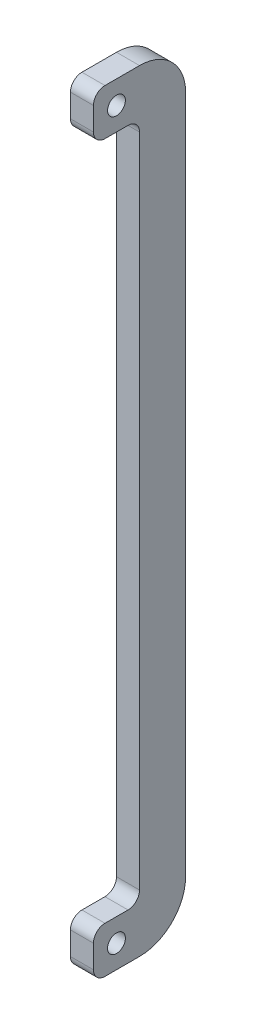
ISO-10303-21;
HEADER;
FILE_DESCRIPTION(('STEP AP214'),'2;1');
FILE_NAME('part.step','',(''),(''),'','','');
FILE_SCHEMA(('AUTOMOTIVE_DESIGN { 1 0 10303 214 1 1 1 1 }'));
ENDSEC;
DATA;
#1=APPLICATION_CONTEXT('core data for automotive mechanical design processes');
#2=APPLICATION_PROTOCOL_DEFINITION('international standard','automotive_design',2000,#1);
#3=PRODUCT_CONTEXT('',#1,'mechanical');
#4=PRODUCT('Part','Part','',(#3));
#5=PRODUCT_RELATED_PRODUCT_CATEGORY('part','',(#4));
#6=PRODUCT_DEFINITION_FORMATION('','',#4);
#7=PRODUCT_DEFINITION_CONTEXT('part definition',#1,'design');
#8=PRODUCT_DEFINITION('design','',#6,#7);
#9=PRODUCT_DEFINITION_SHAPE('','',#8);
#10=(LENGTH_UNIT() NAMED_UNIT(*) SI_UNIT(.MILLI.,.METRE.));
#11=(NAMED_UNIT(*) PLANE_ANGLE_UNIT() SI_UNIT($,.RADIAN.));
#12=(NAMED_UNIT(*) SI_UNIT($,.STERADIAN.) SOLID_ANGLE_UNIT());
#13=UNCERTAINTY_MEASURE_WITH_UNIT(LENGTH_MEASURE(1.E-05),#10,'distance_accuracy_value','');
#14=(GEOMETRIC_REPRESENTATION_CONTEXT(3) GLOBAL_UNCERTAINTY_ASSIGNED_CONTEXT((#13)) GLOBAL_UNIT_ASSIGNED_CONTEXT((#10,
#11,#12)) REPRESENTATION_CONTEXT('',''));
#15=CARTESIAN_POINT('',(0.,0.,0.));
#16=DIRECTION('',(0.,0.,1.));
#17=DIRECTION('',(1.,0.,0.));
#18=AXIS2_PLACEMENT_3D('',#15,#16,#17);
#19=CARTESIAN_POINT('',(4.,-122.02,4.));
#20=DIRECTION('',(-1.,0.,0.));
#21=DIRECTION('',(0.,0.,1.));
#22=AXIS2_PLACEMENT_3D('',#19,#20,#21);
#23=CYLINDRICAL_SURFACE('',#22,1.55);
#24=CARTESIAN_POINT('',(4.,-122.02,4.));
#25=DIRECTION('',(1.,0.,0.));
#26=DIRECTION('',(0.,0.,-1.));
#27=AXIS2_PLACEMENT_3D('',#24,#25,#26);
#28=CIRCLE('',#27,1.55);
#29=CARTESIAN_POINT('',(4.,-122.02,2.45));
#30=VERTEX_POINT('',#29);
#31=EDGE_CURVE('E232',#30,#30,#28,.F.);
#32=ORIENTED_EDGE('',*,*,#31,.F.);
#33=EDGE_LOOP('',(#32));
#34=FACE_BOUND('',#33,.T.);
#35=CARTESIAN_POINT('',(0.,-122.02,4.));
#36=DIRECTION('',(1.,0.,0.));
#37=DIRECTION('',(0.,0.,-1.));
#38=AXIS2_PLACEMENT_3D('',#35,#36,#37);
#39=CIRCLE('',#38,1.55);
#40=CARTESIAN_POINT('',(0.,-122.02,2.45));
#41=VERTEX_POINT('',#40);
#42=EDGE_CURVE('E204',#41,#41,#39,.F.);
#43=ORIENTED_EDGE('',*,*,#42,.T.);
#44=EDGE_LOOP('',(#43));
#45=FACE_BOUND('',#44,.T.);
#46=ADVANCED_FACE('F69',(#34,#45),#23,.F.);
#47=CARTESIAN_POINT('',(4.,4.,4.));
#48=DIRECTION('',(-1.,0.,0.));
#49=DIRECTION('',(0.,0.,1.));
#50=AXIS2_PLACEMENT_3D('',#47,#48,#49);
#51=CYLINDRICAL_SURFACE('',#50,1.55);
#52=CARTESIAN_POINT('',(4.,4.,4.));
#53=DIRECTION('',(1.,0.,0.));
#54=DIRECTION('',(0.,0.,-1.));
#55=AXIS2_PLACEMENT_3D('',#52,#53,#54);
#56=CIRCLE('',#55,1.55);
#57=CARTESIAN_POINT('',(4.,4.,2.45));
#58=VERTEX_POINT('',#57);
#59=EDGE_CURVE('E229',#58,#58,#56,.T.);
#60=ORIENTED_EDGE('',*,*,#59,.T.);
#61=EDGE_LOOP('',(#60));
#62=FACE_BOUND('',#61,.T.);
#63=CARTESIAN_POINT('',(0.,4.,4.));
#64=DIRECTION('',(1.,0.,0.));
#65=DIRECTION('',(0.,0.,-1.));
#66=AXIS2_PLACEMENT_3D('',#63,#64,#65);
#67=CIRCLE('',#66,1.55);
#68=CARTESIAN_POINT('',(0.,4.,2.45));
#69=VERTEX_POINT('',#68);
#70=EDGE_CURVE('E261',#69,#69,#67,.T.);
#71=ORIENTED_EDGE('',*,*,#70,.F.);
#72=EDGE_LOOP('',(#71));
#73=FACE_BOUND('',#72,.T.);
#74=ADVANCED_FACE('F382',(#62,#73),#51,.F.);
#75=CARTESIAN_POINT('',(4.,0.,-8.));
#76=DIRECTION('',(0.,0.,-1.));
#77=DIRECTION('',(0.,1.,0.));
#78=AXIS2_PLACEMENT_3D('',#75,#76,#77);
#79=PLANE('',#78);
#80=DIRECTION('',(0.,-1.,0.));
#81=VECTOR('',#80,1.);
#82=CARTESIAN_POINT('',(0.,0.,-8.));
#83=LINE('',#82,#81);
#84=CARTESIAN_POINT('',(0.,0.,-8.));
#85=VERTEX_POINT('',#84);
#86=CARTESIAN_POINT('',(0.,-118.02,-8.00000000000001));
#87=VERTEX_POINT('',#86);
#88=EDGE_CURVE('E237',#85,#87,#83,.T.);
#89=ORIENTED_EDGE('',*,*,#88,.F.);
#90=DIRECTION('',(-1.,0.,0.));
#91=VECTOR('',#90,1.);
#92=CARTESIAN_POINT('',(4.,0.,-8.));
#93=LINE('',#92,#91);
#94=CARTESIAN_POINT('',(4.,0.,-8.));
#95=VERTEX_POINT('',#94);
#96=EDGE_CURVE('E195',#95,#85,#93,.T.);
#97=ORIENTED_EDGE('',*,*,#96,.F.);
#98=DIRECTION('',(0.,-1.,0.));
#99=VECTOR('',#98,1.);
#100=CARTESIAN_POINT('',(4.,0.,-8.));
#101=LINE('',#100,#99);
#102=CARTESIAN_POINT('',(4.,-118.02,-8.00000000000001));
#103=VERTEX_POINT('',#102);
#104=EDGE_CURVE('E201',#95,#103,#101,.T.);
#105=ORIENTED_EDGE('',*,*,#104,.T.);
#106=DIRECTION('',(-1.,0.,0.));
#107=VECTOR('',#106,1.);
#108=CARTESIAN_POINT('',(4.,-118.02,-8.00000000000001));
#109=LINE('',#108,#107);
#110=EDGE_CURVE('E183',#103,#87,#109,.T.);
#111=ORIENTED_EDGE('',*,*,#110,.T.);
#112=EDGE_LOOP('',(#89,#97,#105,#111));
#113=FACE_BOUND('',#112,.T.);
#114=ADVANCED_FACE('F206',(#113),#79,.T.);
#115=CARTESIAN_POINT('',(4.,0.,0.));
#116=DIRECTION('',(-1.,0.,0.));
#117=DIRECTION('',(0.,0.,1.));
#118=AXIS2_PLACEMENT_3D('',#115,#116,#117);
#119=CYLINDRICAL_SURFACE('',#118,8.);
#120=CARTESIAN_POINT('',(0.,0.,0.));
#121=DIRECTION('',(1.,0.,0.));
#122=DIRECTION('',(0.,0.,-1.));
#123=AXIS2_PLACEMENT_3D('',#120,#121,#122);
#124=CIRCLE('',#123,8.);
#125=CARTESIAN_POINT('',(0.,8.,0.));
#126=VERTEX_POINT('',#125);
#127=EDGE_CURVE('E239',#85,#126,#124,.T.);
#128=ORIENTED_EDGE('',*,*,#127,.T.);
#129=DIRECTION('',(-1.,0.,0.));
#130=VECTOR('',#129,1.);
#131=CARTESIAN_POINT('',(4.,8.,0.));
#132=LINE('',#131,#130);
#133=CARTESIAN_POINT('',(4.,8.,0.));
#134=VERTEX_POINT('',#133);
#135=EDGE_CURVE('E267',#134,#126,#132,.T.);
#136=ORIENTED_EDGE('',*,*,#135,.F.);
#137=CARTESIAN_POINT('',(4.,0.,0.));
#138=DIRECTION('',(1.,0.,0.));
#139=DIRECTION('',(0.,0.,-1.));
#140=AXIS2_PLACEMENT_3D('',#137,#138,#139);
#141=CIRCLE('',#140,8.);
#142=EDGE_CURVE('E208',#95,#134,#141,.T.);
#143=ORIENTED_EDGE('',*,*,#142,.F.);
#144=ORIENTED_EDGE('',*,*,#96,.T.);
#145=EDGE_LOOP('',(#128,#136,#143,#144));
#146=FACE_BOUND('',#145,.T.);
#147=ADVANCED_FACE('F359',(#146),#119,.T.);
#148=CARTESIAN_POINT('',(4.,8.,0.));
#149=DIRECTION('',(0.,-1.,0.));
#150=DIRECTION('',(0.,0.,-1.));
#151=AXIS2_PLACEMENT_3D('',#148,#149,#150);
#152=PLANE('',#151);
#153=DIRECTION('',(0.,0.,1.));
#154=VECTOR('',#153,1.);
#155=CARTESIAN_POINT('',(0.,8.,0.));
#156=LINE('',#155,#154);
#157=CARTESIAN_POINT('',(0.,8.,6.));
#158=VERTEX_POINT('',#157);
#159=EDGE_CURVE('E241',#126,#158,#156,.T.);
#160=ORIENTED_EDGE('',*,*,#159,.T.);
#161=DIRECTION('',(-1.,0.,0.));
#162=VECTOR('',#161,1.);
#163=CARTESIAN_POINT('',(4.,8.,6.));
#164=LINE('',#163,#162);
#165=CARTESIAN_POINT('',(4.,8.,6.));
#166=VERTEX_POINT('',#165);
#167=EDGE_CURVE('E313',#158,#166,#164,.F.);
#168=ORIENTED_EDGE('',*,*,#167,.T.);
#169=DIRECTION('',(0.,0.,1.));
#170=VECTOR('',#169,1.);
#171=CARTESIAN_POINT('',(4.,8.,0.));
#172=LINE('',#171,#170);
#173=EDGE_CURVE('E210',#134,#166,#172,.T.);
#174=ORIENTED_EDGE('',*,*,#173,.F.);
#175=ORIENTED_EDGE('',*,*,#135,.T.);
#176=EDGE_LOOP('',(#160,#168,#174,#175));
#177=FACE_BOUND('',#176,.T.);
#178=ADVANCED_FACE('F362',(#177),#152,.F.);
#179=CARTESIAN_POINT('',(4.,0.,8.));
#180=DIRECTION('',(0.,0.,-1.));
#181=DIRECTION('',(0.,1.,0.));
#182=AXIS2_PLACEMENT_3D('',#179,#180,#181);
#183=PLANE('',#182);
#184=DIRECTION('',(0.,-1.,0.));
#185=VECTOR('',#184,1.);
#186=CARTESIAN_POINT('',(0.,0.,8.));
#187=LINE('',#186,#185);
#188=CARTESIAN_POINT('',(0.,6.,8.));
#189=VERTEX_POINT('',#188);
#190=CARTESIAN_POINT('',(0.,2.,8.));
#191=VERTEX_POINT('',#190);
#192=EDGE_CURVE('E244',#189,#191,#187,.T.);
#193=ORIENTED_EDGE('',*,*,#192,.T.);
#194=DIRECTION('',(-1.,0.,0.));
#195=VECTOR('',#194,1.);
#196=CARTESIAN_POINT('',(4.,2.,8.));
#197=LINE('',#196,#195);
#198=CARTESIAN_POINT('',(4.,2.,8.));
#199=VERTEX_POINT('',#198);
#200=EDGE_CURVE('E311',#191,#199,#197,.F.);
#201=ORIENTED_EDGE('',*,*,#200,.T.);
#202=DIRECTION('',(0.,-1.,0.));
#203=VECTOR('',#202,1.);
#204=CARTESIAN_POINT('',(4.,0.,8.));
#205=LINE('',#204,#203);
#206=CARTESIAN_POINT('',(4.,6.,8.));
#207=VERTEX_POINT('',#206);
#208=EDGE_CURVE('E215',#207,#199,#205,.T.);
#209=ORIENTED_EDGE('',*,*,#208,.F.);
#210=DIRECTION('',(-1.,0.,0.));
#211=VECTOR('',#210,1.);
#212=CARTESIAN_POINT('',(4.,6.,8.));
#213=LINE('',#212,#211);
#214=EDGE_CURVE('E308',#207,#189,#213,.T.);
#215=ORIENTED_EDGE('',*,*,#214,.T.);
#216=EDGE_LOOP('',(#193,#201,#209,#215));
#217=FACE_BOUND('',#216,.T.);
#218=ADVANCED_FACE('F370',(#217),#183,.F.);
#219=CARTESIAN_POINT('',(4.,0.,0.));
#220=DIRECTION('',(0.,-1.,0.));
#221=DIRECTION('',(0.,0.,-1.));
#222=AXIS2_PLACEMENT_3D('',#219,#220,#221);
#223=PLANE('',#222);
#224=DIRECTION('',(0.,0.,1.));
#225=VECTOR('',#224,1.);
#226=CARTESIAN_POINT('',(0.,0.,0.));
#227=LINE('',#226,#225);
#228=CARTESIAN_POINT('',(0.,0.,2.));
#229=VERTEX_POINT('',#228);
#230=CARTESIAN_POINT('',(0.,0.,6.));
#231=VERTEX_POINT('',#230);
#232=EDGE_CURVE('E247',#229,#231,#227,.T.);
#233=ORIENTED_EDGE('',*,*,#232,.F.);
#234=DIRECTION('',(-1.,0.,0.));
#235=VECTOR('',#234,1.);
#236=CARTESIAN_POINT('',(4.,0.,2.));
#237=LINE('',#236,#235);
#238=CARTESIAN_POINT('',(4.,0.,2.));
#239=VERTEX_POINT('',#238);
#240=EDGE_CURVE('E306',#229,#239,#237,.F.);
#241=ORIENTED_EDGE('',*,*,#240,.T.);
#242=DIRECTION('',(0.,0.,1.));
#243=VECTOR('',#242,1.);
#244=CARTESIAN_POINT('',(4.,0.,0.));
#245=LINE('',#244,#243);
#246=CARTESIAN_POINT('',(4.,0.,6.));
#247=VERTEX_POINT('',#246);
#248=EDGE_CURVE('E218',#239,#247,#245,.T.);
#249=ORIENTED_EDGE('',*,*,#248,.T.);
#250=DIRECTION('',(-1.,0.,0.));
#251=VECTOR('',#250,1.);
#252=CARTESIAN_POINT('',(0.,0.,6.));
#253=LINE('',#252,#251);
#254=EDGE_CURVE('E303',#247,#231,#253,.T.);
#255=ORIENTED_EDGE('',*,*,#254,.T.);
#256=EDGE_LOOP('',(#233,#241,#249,#255));
#257=FACE_BOUND('',#256,.T.);
#258=ADVANCED_FACE('F326',(#257),#223,.T.);
#259=CARTESIAN_POINT('',(4.,0.,0.));
#260=DIRECTION('',(0.,0.,-1.));
#261=DIRECTION('',(0.,1.,0.));
#262=AXIS2_PLACEMENT_3D('',#259,#260,#261);
#263=PLANE('',#262);
#264=DIRECTION('',(0.,-1.,0.));
#265=VECTOR('',#264,1.);
#266=CARTESIAN_POINT('',(0.,0.,0.));
#267=LINE('',#266,#265);
#268=CARTESIAN_POINT('',(0.,-2.,0.));
#269=VERTEX_POINT('',#268);
#270=CARTESIAN_POINT('',(0.,-116.02,0.));
#271=VERTEX_POINT('',#270);
#272=EDGE_CURVE('E250',#269,#271,#267,.T.);
#273=ORIENTED_EDGE('',*,*,#272,.T.);
#274=DIRECTION('',(-1.,0.,0.));
#275=VECTOR('',#274,1.);
#276=CARTESIAN_POINT('',(4.,-116.02,0.));
#277=LINE('',#276,#275);
#278=CARTESIAN_POINT('',(4.,-116.02,0.));
#279=VERTEX_POINT('',#278);
#280=EDGE_CURVE('E301',#271,#279,#277,.F.);
#281=ORIENTED_EDGE('',*,*,#280,.T.);
#282=DIRECTION('',(0.,-1.,0.));
#283=VECTOR('',#282,1.);
#284=CARTESIAN_POINT('',(4.,0.,0.));
#285=LINE('',#284,#283);
#286=CARTESIAN_POINT('',(4.,-2.,0.));
#287=VERTEX_POINT('',#286);
#288=EDGE_CURVE('E221',#287,#279,#285,.T.);
#289=ORIENTED_EDGE('',*,*,#288,.F.);
#290=DIRECTION('',(-1.,0.,0.));
#291=VECTOR('',#290,1.);
#292=CARTESIAN_POINT('',(4.,-2.,0.));
#293=LINE('',#292,#291);
#294=EDGE_CURVE('E298',#287,#269,#293,.T.);
#295=ORIENTED_EDGE('',*,*,#294,.T.);
#296=EDGE_LOOP('',(#273,#281,#289,#295));
#297=FACE_BOUND('',#296,.T.);
#298=ADVANCED_FACE('F333',(#297),#263,.F.);
#299=CARTESIAN_POINT('',(4.,-118.02,0.));
#300=DIRECTION('',(0.,-1.,0.));
#301=DIRECTION('',(0.,0.,-1.));
#302=AXIS2_PLACEMENT_3D('',#299,#300,#301);
#303=PLANE('',#302);
#304=DIRECTION('',(0.,0.,1.));
#305=VECTOR('',#304,1.);
#306=CARTESIAN_POINT('',(0.,-118.02,0.));
#307=LINE('',#306,#305);
#308=CARTESIAN_POINT('',(0.,-118.02,1.99999999999999));
#309=VERTEX_POINT('',#308);
#310=CARTESIAN_POINT('',(0.,-118.02,6.));
#311=VERTEX_POINT('',#310);
#312=EDGE_CURVE('E253',#309,#311,#307,.T.);
#313=ORIENTED_EDGE('',*,*,#312,.T.);
#314=DIRECTION('',(-1.,0.,0.));
#315=VECTOR('',#314,1.);
#316=CARTESIAN_POINT('',(4.,-118.02,6.));
#317=LINE('',#316,#315);
#318=CARTESIAN_POINT('',(4.,-118.02,6.));
#319=VERTEX_POINT('',#318);
#320=EDGE_CURVE('E84',#311,#319,#317,.F.);
#321=ORIENTED_EDGE('',*,*,#320,.T.);
#322=DIRECTION('',(0.,0.,1.));
#323=VECTOR('',#322,1.);
#324=CARTESIAN_POINT('',(4.,-118.02,0.));
#325=LINE('',#324,#323);
#326=CARTESIAN_POINT('',(4.,-118.02,1.99999999999999));
#327=VERTEX_POINT('',#326);
#328=EDGE_CURVE('E223',#327,#319,#325,.T.);
#329=ORIENTED_EDGE('',*,*,#328,.F.);
#330=DIRECTION('',(-1.,0.,0.));
#331=VECTOR('',#330,1.);
#332=CARTESIAN_POINT('',(0.,-118.02,1.99999999999999));
#333=LINE('',#332,#331);
#334=EDGE_CURVE('E294',#327,#309,#333,.T.);
#335=ORIENTED_EDGE('',*,*,#334,.T.);
#336=EDGE_LOOP('',(#313,#321,#329,#335));
#337=FACE_BOUND('',#336,.T.);
#338=ADVANCED_FACE('F339',(#337),#303,.F.);
#339=CARTESIAN_POINT('',(4.,0.,7.99999999999994));
#340=DIRECTION('',(0.,0.,1.));
#341=DIRECTION('',(0.,-1.,0.));
#342=AXIS2_PLACEMENT_3D('',#339,#340,#341);
#343=PLANE('',#342);
#344=DIRECTION('',(0.,1.,0.));
#345=VECTOR('',#344,1.);
#346=CARTESIAN_POINT('',(0.,0.,7.99999999999994));
#347=LINE('',#346,#345);
#348=CARTESIAN_POINT('',(0.,-124.02,8.));
#349=VERTEX_POINT('',#348);
#350=CARTESIAN_POINT('',(0.,-120.02,8.));
#351=VERTEX_POINT('',#350);
#352=EDGE_CURVE('E255',#349,#351,#347,.T.);
#353=ORIENTED_EDGE('',*,*,#352,.F.);
#354=DIRECTION('',(-1.,0.,0.));
#355=VECTOR('',#354,1.);
#356=CARTESIAN_POINT('',(4.,-124.02,8.));
#357=LINE('',#356,#355);
#358=CARTESIAN_POINT('',(4.,-124.02,8.));
#359=VERTEX_POINT('',#358);
#360=EDGE_CURVE('E284',#349,#359,#357,.F.);
#361=ORIENTED_EDGE('',*,*,#360,.T.);
#362=DIRECTION('',(0.,1.,0.));
#363=VECTOR('',#362,1.);
#364=CARTESIAN_POINT('',(4.,0.,7.99999999999994));
#365=LINE('',#364,#363);
#366=CARTESIAN_POINT('',(4.,-120.02,8.));
#367=VERTEX_POINT('',#366);
#368=EDGE_CURVE('E225',#359,#367,#365,.T.);
#369=ORIENTED_EDGE('',*,*,#368,.T.);
#370=DIRECTION('',(-1.,0.,0.));
#371=VECTOR('',#370,1.);
#372=CARTESIAN_POINT('',(0.,-120.02,8.));
#373=LINE('',#372,#371);
#374=EDGE_CURVE('E281',#367,#351,#373,.T.);
#375=ORIENTED_EDGE('',*,*,#374,.T.);
#376=EDGE_LOOP('',(#353,#361,#369,#375));
#377=FACE_BOUND('',#376,.T.);
#378=ADVANCED_FACE('F346',(#377),#343,.T.);
#379=CARTESIAN_POINT('',(4.,-126.02,4.37219704885195E-13));
#380=DIRECTION('',(0.,-1.,0.));
#381=DIRECTION('',(0.,0.,-1.));
#382=AXIS2_PLACEMENT_3D('',#379,#380,#381);
#383=PLANE('',#382);
#384=DIRECTION('',(0.,0.,1.));
#385=VECTOR('',#384,1.);
#386=CARTESIAN_POINT('',(4.,-126.02,4.37219704885195E-13));
#387=LINE('',#386,#385);
#388=CARTESIAN_POINT('',(4.,-126.02,0.));
#389=VERTEX_POINT('',#388);
#390=CARTESIAN_POINT('',(4.,-126.02,6.00000000000001));
#391=VERTEX_POINT('',#390);
#392=EDGE_CURVE('E203',#389,#391,#387,.T.);
#393=ORIENTED_EDGE('',*,*,#392,.T.);
#394=DIRECTION('',(-1.,0.,0.));
#395=VECTOR('',#394,1.);
#396=CARTESIAN_POINT('',(4.,-126.02,6.00000000000001));
#397=LINE('',#396,#395);
#398=CARTESIAN_POINT('',(0.,-126.02,6.00000000000001));
#399=VERTEX_POINT('',#398);
#400=EDGE_CURVE('E194',#391,#399,#397,.T.);
#401=ORIENTED_EDGE('',*,*,#400,.T.);
#402=DIRECTION('',(0.,0.,1.));
#403=VECTOR('',#402,1.);
#404=CARTESIAN_POINT('',(0.,-126.02,4.37219704885195E-13));
#405=LINE('',#404,#403);
#406=CARTESIAN_POINT('',(0.,-126.02,0.));
#407=VERTEX_POINT('',#406);
#408=EDGE_CURVE('E258',#407,#399,#405,.T.);
#409=ORIENTED_EDGE('',*,*,#408,.F.);
#410=DIRECTION('',(-1.,0.,0.));
#411=VECTOR('',#410,1.);
#412=CARTESIAN_POINT('',(4.,-126.02,0.));
#413=LINE('',#412,#411);
#414=EDGE_CURVE('E235',#389,#407,#413,.T.);
#415=ORIENTED_EDGE('',*,*,#414,.F.);
#416=EDGE_LOOP('',(#393,#401,#409,#415));
#417=FACE_BOUND('',#416,.T.);
#418=ADVANCED_FACE('F354',(#417),#383,.T.);
#419=CARTESIAN_POINT('',(4.,-118.02,0.));
#420=DIRECTION('',(-1.,0.,0.));
#421=DIRECTION('',(0.,0.,1.));
#422=AXIS2_PLACEMENT_3D('',#419,#420,#421);
#423=CYLINDRICAL_SURFACE('',#422,8.);
#424=CARTESIAN_POINT('',(0.,-118.02,0.));
#425=DIRECTION('',(1.,0.,0.));
#426=DIRECTION('',(0.,0.,-1.));
#427=AXIS2_PLACEMENT_3D('',#424,#425,#426);
#428=CIRCLE('',#427,8.);
#429=EDGE_CURVE('E189',#87,#407,#428,.F.);
#430=ORIENTED_EDGE('',*,*,#429,.F.);
#431=ORIENTED_EDGE('',*,*,#110,.F.);
#432=CARTESIAN_POINT('',(4.,-118.02,0.));
#433=DIRECTION('',(1.,0.,0.));
#434=DIRECTION('',(0.,0.,-1.));
#435=AXIS2_PLACEMENT_3D('',#432,#433,#434);
#436=CIRCLE('',#435,8.);
#437=EDGE_CURVE('E186',#103,#389,#436,.F.);
#438=ORIENTED_EDGE('',*,*,#437,.T.);
#439=ORIENTED_EDGE('',*,*,#414,.T.);
#440=EDGE_LOOP('',(#430,#431,#438,#439));
#441=FACE_BOUND('',#440,.T.);
#442=ADVANCED_FACE('F185',(#441),#423,.T.);
#443=CARTESIAN_POINT('',(0.,0.,0.));
#444=DIRECTION('',(1.,0.,0.));
#445=DIRECTION('',(0.,0.,-1.));
#446=AXIS2_PLACEMENT_3D('',#443,#444,#445);
#447=PLANE('',#446);
#448=ORIENTED_EDGE('',*,*,#408,.T.);
#449=CARTESIAN_POINT('',(0.,-124.02,6.));
#450=DIRECTION('',(1.,0.,0.));
#451=DIRECTION('',(0.,0.,-1.));
#452=AXIS2_PLACEMENT_3D('',#449,#450,#451);
#453=CIRCLE('',#452,2.);
#454=EDGE_CURVE('E279',#399,#349,#453,.F.);
#455=ORIENTED_EDGE('',*,*,#454,.T.);
#456=ORIENTED_EDGE('',*,*,#352,.T.);
#457=CARTESIAN_POINT('',(0.,-120.02,6.));
#458=DIRECTION('',(1.,0.,0.));
#459=DIRECTION('',(0.,0.,-1.));
#460=AXIS2_PLACEMENT_3D('',#457,#458,#459);
#461=CIRCLE('',#460,2.);
#462=EDGE_CURVE('E277',#351,#311,#461,.F.);
#463=ORIENTED_EDGE('',*,*,#462,.T.);
#464=ORIENTED_EDGE('',*,*,#312,.F.);
#465=CARTESIAN_POINT('',(0.,-116.02,1.99999999999999));
#466=DIRECTION('',(1.,0.,0.));
#467=DIRECTION('',(0.,0.,-1.));
#468=AXIS2_PLACEMENT_3D('',#465,#466,#467);
#469=CIRCLE('',#468,2.);
#470=EDGE_CURVE('E315',#309,#271,#469,.T.);
#471=ORIENTED_EDGE('',*,*,#470,.T.);
#472=ORIENTED_EDGE('',*,*,#272,.F.);
#473=CARTESIAN_POINT('',(0.,-2.,2.));
#474=DIRECTION('',(1.,0.,0.));
#475=DIRECTION('',(0.,0.,-1.));
#476=AXIS2_PLACEMENT_3D('',#473,#474,#475);
#477=CIRCLE('',#476,2.);
#478=EDGE_CURVE('E77',#269,#229,#477,.T.);
#479=ORIENTED_EDGE('',*,*,#478,.T.);
#480=ORIENTED_EDGE('',*,*,#232,.T.);
#481=CARTESIAN_POINT('',(0.,2.,6.));
#482=DIRECTION('',(1.,0.,0.));
#483=DIRECTION('',(0.,0.,-1.));
#484=AXIS2_PLACEMENT_3D('',#481,#482,#483);
#485=CIRCLE('',#484,2.);
#486=EDGE_CURVE('E275',#231,#191,#485,.F.);
#487=ORIENTED_EDGE('',*,*,#486,.T.);
#488=ORIENTED_EDGE('',*,*,#192,.F.);
#489=CARTESIAN_POINT('',(0.,6.,6.));
#490=DIRECTION('',(1.,0.,0.));
#491=DIRECTION('',(0.,0.,-1.));
#492=AXIS2_PLACEMENT_3D('',#489,#490,#491);
#493=CIRCLE('',#492,2.);
#494=EDGE_CURVE('E273',#189,#158,#493,.F.);
#495=ORIENTED_EDGE('',*,*,#494,.T.);
#496=ORIENTED_EDGE('',*,*,#159,.F.);
#497=ORIENTED_EDGE('',*,*,#127,.F.);
#498=ORIENTED_EDGE('',*,*,#88,.T.);
#499=ORIENTED_EDGE('',*,*,#429,.T.);
#500=EDGE_LOOP('',(#448,#455,#456,#463,#464,#471,#472,#479,#480,#487,#488,#495,#496,#497,#498,#499));
#501=FACE_BOUND('',#500,.T.);
#502=ORIENTED_EDGE('',*,*,#70,.T.);
#503=EDGE_LOOP('',(#502));
#504=FACE_BOUND('',#503,.T.);
#505=ORIENTED_EDGE('',*,*,#42,.F.);
#506=EDGE_LOOP('',(#505));
#507=FACE_BOUND('',#506,.T.);
#508=ADVANCED_FACE('F320',(#501,#504,#507),#447,.F.);
#509=CARTESIAN_POINT('',(4.,0.,0.));
#510=DIRECTION('',(1.,0.,0.));
#511=DIRECTION('',(0.,0.,-1.));
#512=AXIS2_PLACEMENT_3D('',#509,#510,#511);
#513=PLANE('',#512);
#514=ORIENTED_EDGE('',*,*,#368,.F.);
#515=CARTESIAN_POINT('',(4.,-124.02,6.));
#516=DIRECTION('',(1.,0.,0.));
#517=DIRECTION('',(0.,0.,-1.));
#518=AXIS2_PLACEMENT_3D('',#515,#516,#517);
#519=CIRCLE('',#518,2.);
#520=EDGE_CURVE('E292',#359,#391,#519,.T.);
#521=ORIENTED_EDGE('',*,*,#520,.T.);
#522=ORIENTED_EDGE('',*,*,#392,.F.);
#523=ORIENTED_EDGE('',*,*,#437,.F.);
#524=ORIENTED_EDGE('',*,*,#104,.F.);
#525=ORIENTED_EDGE('',*,*,#142,.T.);
#526=ORIENTED_EDGE('',*,*,#173,.T.);
#527=CARTESIAN_POINT('',(4.,6.,6.));
#528=DIRECTION('',(1.,0.,0.));
#529=DIRECTION('',(0.,0.,-1.));
#530=AXIS2_PLACEMENT_3D('',#527,#528,#529);
#531=CIRCLE('',#530,2.);
#532=EDGE_CURVE('E286',#166,#207,#531,.T.);
#533=ORIENTED_EDGE('',*,*,#532,.T.);
#534=ORIENTED_EDGE('',*,*,#208,.T.);
#535=CARTESIAN_POINT('',(4.,2.,6.));
#536=DIRECTION('',(1.,0.,0.));
#537=DIRECTION('',(0.,0.,-1.));
#538=AXIS2_PLACEMENT_3D('',#535,#536,#537);
#539=CIRCLE('',#538,2.);
#540=EDGE_CURVE('E288',#199,#247,#539,.T.);
#541=ORIENTED_EDGE('',*,*,#540,.T.);
#542=ORIENTED_EDGE('',*,*,#248,.F.);
#543=CARTESIAN_POINT('',(4.,-2.,2.));
#544=DIRECTION('',(1.,0.,0.));
#545=DIRECTION('',(0.,0.,-1.));
#546=AXIS2_PLACEMENT_3D('',#543,#544,#545);
#547=CIRCLE('',#546,2.);
#548=EDGE_CURVE('E12',#239,#287,#547,.F.);
#549=ORIENTED_EDGE('',*,*,#548,.T.);
#550=ORIENTED_EDGE('',*,*,#288,.T.);
#551=CARTESIAN_POINT('',(4.,-116.02,1.99999999999999));
#552=DIRECTION('',(1.,0.,0.));
#553=DIRECTION('',(0.,0.,-1.));
#554=AXIS2_PLACEMENT_3D('',#551,#552,#553);
#555=CIRCLE('',#554,2.);
#556=EDGE_CURVE('E91',#279,#327,#555,.F.);
#557=ORIENTED_EDGE('',*,*,#556,.T.);
#558=ORIENTED_EDGE('',*,*,#328,.T.);
#559=CARTESIAN_POINT('',(4.,-120.02,6.));
#560=DIRECTION('',(1.,0.,0.));
#561=DIRECTION('',(0.,0.,-1.));
#562=AXIS2_PLACEMENT_3D('',#559,#560,#561);
#563=CIRCLE('',#562,2.);
#564=EDGE_CURVE('E290',#319,#367,#563,.T.);
#565=ORIENTED_EDGE('',*,*,#564,.T.);
#566=EDGE_LOOP('',(#514,#521,#522,#523,#524,#525,#526,#533,#534,#541,#542,#549,#550,#557,#558,#565));
#567=FACE_BOUND('',#566,.T.);
#568=ORIENTED_EDGE('',*,*,#59,.F.);
#569=EDGE_LOOP('',(#568));
#570=FACE_BOUND('',#569,.T.);
#571=ORIENTED_EDGE('',*,*,#31,.T.);
#572=EDGE_LOOP('',(#571));
#573=FACE_BOUND('',#572,.T.);
#574=ADVANCED_FACE('F199',(#567,#570,#573),#513,.T.);
#575=CARTESIAN_POINT('',(4.,-124.02,6.));
#576=DIRECTION('',(-1.,0.,0.));
#577=DIRECTION('',(0.,0.,1.));
#578=AXIS2_PLACEMENT_3D('',#575,#576,#577);
#579=CYLINDRICAL_SURFACE('',#578,2.);
#580=ORIENTED_EDGE('',*,*,#520,.F.);
#581=ORIENTED_EDGE('',*,*,#360,.F.);
#582=ORIENTED_EDGE('',*,*,#454,.F.);
#583=ORIENTED_EDGE('',*,*,#400,.F.);
#584=EDGE_LOOP('',(#580,#581,#582,#583));
#585=FACE_BOUND('',#584,.T.);
#586=ADVANCED_FACE('F351',(#585),#579,.T.);
#587=CARTESIAN_POINT('',(4.,-120.02,6.));
#588=DIRECTION('',(1.,0.,0.));
#589=DIRECTION('',(0.,0.,-1.));
#590=AXIS2_PLACEMENT_3D('',#587,#588,#589);
#591=CYLINDRICAL_SURFACE('',#590,2.);
#592=ORIENTED_EDGE('',*,*,#564,.F.);
#593=ORIENTED_EDGE('',*,*,#320,.F.);
#594=ORIENTED_EDGE('',*,*,#462,.F.);
#595=ORIENTED_EDGE('',*,*,#374,.F.);
#596=EDGE_LOOP('',(#592,#593,#594,#595));
#597=FACE_BOUND('',#596,.T.);
#598=ADVANCED_FACE('F344',(#597),#591,.T.);
#599=CARTESIAN_POINT('',(4.,-116.02,1.99999999999999));
#600=DIRECTION('',(1.,0.,0.));
#601=DIRECTION('',(0.,0.,-1.));
#602=AXIS2_PLACEMENT_3D('',#599,#600,#601);
#603=CYLINDRICAL_SURFACE('',#602,2.);
#604=ORIENTED_EDGE('',*,*,#556,.F.);
#605=ORIENTED_EDGE('',*,*,#280,.F.);
#606=ORIENTED_EDGE('',*,*,#470,.F.);
#607=ORIENTED_EDGE('',*,*,#334,.F.);
#608=EDGE_LOOP('',(#604,#605,#606,#607));
#609=FACE_BOUND('',#608,.T.);
#610=ADVANCED_FACE('F336',(#609),#603,.F.);
#611=CARTESIAN_POINT('',(4.,-2.,2.));
#612=DIRECTION('',(-1.,0.,0.));
#613=DIRECTION('',(0.,0.,1.));
#614=AXIS2_PLACEMENT_3D('',#611,#612,#613);
#615=CYLINDRICAL_SURFACE('',#614,2.);
#616=ORIENTED_EDGE('',*,*,#548,.F.);
#617=ORIENTED_EDGE('',*,*,#240,.F.);
#618=ORIENTED_EDGE('',*,*,#478,.F.);
#619=ORIENTED_EDGE('',*,*,#294,.F.);
#620=EDGE_LOOP('',(#616,#617,#618,#619));
#621=FACE_BOUND('',#620,.T.);
#622=ADVANCED_FACE('F330',(#621),#615,.F.);
#623=CARTESIAN_POINT('',(4.,2.,6.));
#624=DIRECTION('',(1.,0.,0.));
#625=DIRECTION('',(0.,0.,-1.));
#626=AXIS2_PLACEMENT_3D('',#623,#624,#625);
#627=CYLINDRICAL_SURFACE('',#626,2.);
#628=ORIENTED_EDGE('',*,*,#540,.F.);
#629=ORIENTED_EDGE('',*,*,#200,.F.);
#630=ORIENTED_EDGE('',*,*,#486,.F.);
#631=ORIENTED_EDGE('',*,*,#254,.F.);
#632=EDGE_LOOP('',(#628,#629,#630,#631));
#633=FACE_BOUND('',#632,.T.);
#634=ADVANCED_FACE('F374',(#633),#627,.T.);
#635=CARTESIAN_POINT('',(4.,6.,6.));
#636=DIRECTION('',(-1.,0.,0.));
#637=DIRECTION('',(0.,0.,1.));
#638=AXIS2_PLACEMENT_3D('',#635,#636,#637);
#639=CYLINDRICAL_SURFACE('',#638,2.);
#640=ORIENTED_EDGE('',*,*,#532,.F.);
#641=ORIENTED_EDGE('',*,*,#167,.F.);
#642=ORIENTED_EDGE('',*,*,#494,.F.);
#643=ORIENTED_EDGE('',*,*,#214,.F.);
#644=EDGE_LOOP('',(#640,#641,#642,#643));
#645=FACE_BOUND('',#644,.T.);
#646=ADVANCED_FACE('F71',(#645),#639,.T.);
#647=CLOSED_SHELL('',(#46,#74,#114,#147,#178,#218,#258,#298,#338,#378,#418,#442,#508,#574,#586,
#598,#610,#622,#634,#646));
#648=MANIFOLD_SOLID_BREP('B2',#647);
#649=ADVANCED_BREP_SHAPE_REPRESENTATION('',(#18,#648),#14);
#650=SHAPE_DEFINITION_REPRESENTATION(#9,#649);
ENDSEC;
END-ISO-10303-21;
